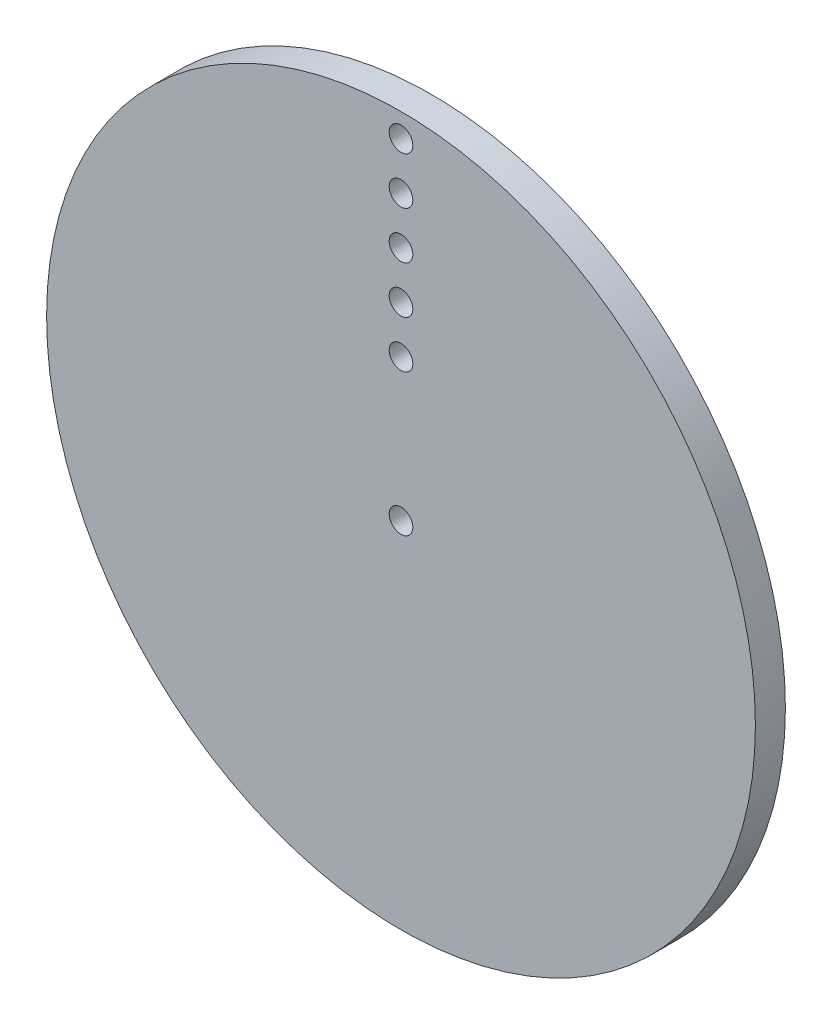
ISO-10303-21;
HEADER;
FILE_DESCRIPTION(('STEP AP214'),'2;1');
FILE_NAME('part.step','',(''),(''),'','','');
FILE_SCHEMA(('AUTOMOTIVE_DESIGN { 1 0 10303 214 1 1 1 1 }'));
ENDSEC;
DATA;
#1=APPLICATION_CONTEXT('core data for automotive mechanical design processes');
#2=APPLICATION_PROTOCOL_DEFINITION('international standard','automotive_design',2000,#1);
#3=PRODUCT_CONTEXT('',#1,'mechanical');
#4=PRODUCT('Part','Part','',(#3));
#5=PRODUCT_RELATED_PRODUCT_CATEGORY('part','',(#4));
#6=PRODUCT_DEFINITION_FORMATION('','',#4);
#7=PRODUCT_DEFINITION_CONTEXT('part definition',#1,'design');
#8=PRODUCT_DEFINITION('design','',#6,#7);
#9=PRODUCT_DEFINITION_SHAPE('','',#8);
#10=(LENGTH_UNIT() NAMED_UNIT(*) SI_UNIT(.MILLI.,.METRE.));
#11=(NAMED_UNIT(*) PLANE_ANGLE_UNIT() SI_UNIT($,.RADIAN.));
#12=(NAMED_UNIT(*) SI_UNIT($,.STERADIAN.) SOLID_ANGLE_UNIT());
#13=UNCERTAINTY_MEASURE_WITH_UNIT(LENGTH_MEASURE(1.E-05),#10,'distance_accuracy_value','');
#14=(GEOMETRIC_REPRESENTATION_CONTEXT(3) GLOBAL_UNCERTAINTY_ASSIGNED_CONTEXT((#13)) GLOBAL_UNIT_ASSIGNED_CONTEXT((#10,
#11,#12)) REPRESENTATION_CONTEXT('',''));
#15=CARTESIAN_POINT('',(0.,0.,0.));
#16=DIRECTION('',(0.,0.,1.));
#17=DIRECTION('',(1.,0.,0.));
#18=AXIS2_PLACEMENT_3D('',#15,#16,#17);
#19=CARTESIAN_POINT('',(0.,0.,6.35));
#20=DIRECTION('',(0.,0.,1.));
#21=DIRECTION('',(1.,0.,0.));
#22=AXIS2_PLACEMENT_3D('',#19,#20,#21);
#23=PLANE('',#22);
#24=CARTESIAN_POINT('',(0.,70.,6.35));
#25=DIRECTION('',(0.,0.,1.));
#26=DIRECTION('',(1.,0.,0.));
#27=AXIS2_PLACEMENT_3D('',#24,#25,#26);
#28=CIRCLE('',#27,2.5);
#29=CARTESIAN_POINT('',(2.5,70.,6.35));
#30=VERTEX_POINT('',#29);
#31=EDGE_CURVE('E68',#30,#30,#28,.T.);
#32=ORIENTED_EDGE('',*,*,#31,.F.);
#33=EDGE_LOOP('',(#32));
#34=FACE_BOUND('',#33,.T.);
#35=CARTESIAN_POINT('',(0.,50.,6.35));
#36=DIRECTION('',(0.,0.,1.));
#37=DIRECTION('',(1.,0.,0.));
#38=AXIS2_PLACEMENT_3D('',#35,#36,#37);
#39=CIRCLE('',#38,2.5);
#40=CARTESIAN_POINT('',(2.5,50.,6.35));
#41=VERTEX_POINT('',#40);
#42=EDGE_CURVE('E56',#41,#41,#39,.T.);
#43=ORIENTED_EDGE('',*,*,#42,.F.);
#44=EDGE_LOOP('',(#43));
#45=FACE_BOUND('',#44,.T.);
#46=CARTESIAN_POINT('',(0.,30.,6.35));
#47=DIRECTION('',(0.,0.,1.));
#48=DIRECTION('',(1.,0.,0.));
#49=AXIS2_PLACEMENT_3D('',#46,#47,#48);
#50=CIRCLE('',#49,2.5);
#51=CARTESIAN_POINT('',(2.5,30.,6.35));
#52=VERTEX_POINT('',#51);
#53=EDGE_CURVE('E45',#52,#52,#50,.T.);
#54=ORIENTED_EDGE('',*,*,#53,.F.);
#55=EDGE_LOOP('',(#54));
#56=FACE_BOUND('',#55,.T.);
#57=CARTESIAN_POINT('',(0.,0.,6.35));
#58=DIRECTION('',(0.,0.,1.));
#59=DIRECTION('',(1.,0.,0.));
#60=AXIS2_PLACEMENT_3D('',#57,#58,#59);
#61=CIRCLE('',#60,75.);
#62=CARTESIAN_POINT('',(75.,0.,6.35));
#63=VERTEX_POINT('',#62);
#64=EDGE_CURVE('E10',#63,#63,#61,.T.);
#65=ORIENTED_EDGE('',*,*,#64,.T.);
#66=EDGE_LOOP('',(#65));
#67=FACE_BOUND('',#66,.T.);
#68=CARTESIAN_POINT('',(0.,40.,6.35));
#69=DIRECTION('',(0.,0.,1.));
#70=DIRECTION('',(1.,0.,0.));
#71=AXIS2_PLACEMENT_3D('',#68,#69,#70);
#72=CIRCLE('',#71,2.5);
#73=CARTESIAN_POINT('',(2.5,40.,6.35));
#74=VERTEX_POINT('',#73);
#75=EDGE_CURVE('E50',#74,#74,#72,.T.);
#76=ORIENTED_EDGE('',*,*,#75,.F.);
#77=EDGE_LOOP('',(#76));
#78=FACE_BOUND('',#77,.T.);
#79=CARTESIAN_POINT('',(0.,60.,6.35));
#80=DIRECTION('',(0.,0.,1.));
#81=DIRECTION('',(1.,0.,0.));
#82=AXIS2_PLACEMENT_3D('',#79,#80,#81);
#83=CIRCLE('',#82,2.5);
#84=CARTESIAN_POINT('',(2.5,60.,6.35));
#85=VERTEX_POINT('',#84);
#86=EDGE_CURVE('E62',#85,#85,#83,.T.);
#87=ORIENTED_EDGE('',*,*,#86,.F.);
#88=EDGE_LOOP('',(#87));
#89=FACE_BOUND('',#88,.T.);
#90=CARTESIAN_POINT('',(0.,0.,6.35));
#91=DIRECTION('',(0.,0.,1.));
#92=DIRECTION('',(1.,0.,0.));
#93=AXIS2_PLACEMENT_3D('',#90,#91,#92);
#94=CIRCLE('',#93,2.5);
#95=CARTESIAN_POINT('',(2.5,0.,6.35));
#96=VERTEX_POINT('',#95);
#97=EDGE_CURVE('E74',#96,#96,#94,.T.);
#98=ORIENTED_EDGE('',*,*,#97,.F.);
#99=EDGE_LOOP('',(#98));
#100=FACE_BOUND('',#99,.T.);
#101=ADVANCED_FACE('F34',(#34,#45,#56,#67,#78,#89,#100),#23,.T.);
#102=CARTESIAN_POINT('',(0.,0.,0.));
#103=DIRECTION('',(0.,0.,1.));
#104=DIRECTION('',(1.,0.,0.));
#105=AXIS2_PLACEMENT_3D('',#102,#103,#104);
#106=PLANE('',#105);
#107=CARTESIAN_POINT('',(0.,0.,0.));
#108=DIRECTION('',(0.,0.,1.));
#109=DIRECTION('',(1.,0.,0.));
#110=AXIS2_PLACEMENT_3D('',#107,#108,#109);
#111=CIRCLE('',#110,75.);
#112=CARTESIAN_POINT('',(75.,0.,0.));
#113=VERTEX_POINT('',#112);
#114=EDGE_CURVE('E38',#113,#113,#111,.T.);
#115=ORIENTED_EDGE('',*,*,#114,.F.);
#116=EDGE_LOOP('',(#115));
#117=FACE_BOUND('',#116,.T.);
#118=CARTESIAN_POINT('',(0.,30.,0.));
#119=DIRECTION('',(0.,0.,1.));
#120=DIRECTION('',(1.,0.,0.));
#121=AXIS2_PLACEMENT_3D('',#118,#119,#120);
#122=CIRCLE('',#121,2.5);
#123=CARTESIAN_POINT('',(2.5,30.,0.));
#124=VERTEX_POINT('',#123);
#125=EDGE_CURVE('E47',#124,#124,#122,.T.);
#126=ORIENTED_EDGE('',*,*,#125,.T.);
#127=EDGE_LOOP('',(#126));
#128=FACE_BOUND('',#127,.T.);
#129=CARTESIAN_POINT('',(0.,40.,0.));
#130=DIRECTION('',(0.,0.,1.));
#131=DIRECTION('',(1.,0.,0.));
#132=AXIS2_PLACEMENT_3D('',#129,#130,#131);
#133=CIRCLE('',#132,2.5);
#134=CARTESIAN_POINT('',(2.5,40.,0.));
#135=VERTEX_POINT('',#134);
#136=EDGE_CURVE('E53',#135,#135,#133,.T.);
#137=ORIENTED_EDGE('',*,*,#136,.T.);
#138=EDGE_LOOP('',(#137));
#139=FACE_BOUND('',#138,.T.);
#140=CARTESIAN_POINT('',(0.,50.,0.));
#141=DIRECTION('',(0.,0.,1.));
#142=DIRECTION('',(1.,0.,0.));
#143=AXIS2_PLACEMENT_3D('',#140,#141,#142);
#144=CIRCLE('',#143,2.5);
#145=CARTESIAN_POINT('',(2.5,50.,0.));
#146=VERTEX_POINT('',#145);
#147=EDGE_CURVE('E59',#146,#146,#144,.T.);
#148=ORIENTED_EDGE('',*,*,#147,.T.);
#149=EDGE_LOOP('',(#148));
#150=FACE_BOUND('',#149,.T.);
#151=CARTESIAN_POINT('',(0.,60.,0.));
#152=DIRECTION('',(0.,0.,1.));
#153=DIRECTION('',(1.,0.,0.));
#154=AXIS2_PLACEMENT_3D('',#151,#152,#153);
#155=CIRCLE('',#154,2.5);
#156=CARTESIAN_POINT('',(2.5,60.,0.));
#157=VERTEX_POINT('',#156);
#158=EDGE_CURVE('E65',#157,#157,#155,.T.);
#159=ORIENTED_EDGE('',*,*,#158,.T.);
#160=EDGE_LOOP('',(#159));
#161=FACE_BOUND('',#160,.T.);
#162=CARTESIAN_POINT('',(0.,70.,0.));
#163=DIRECTION('',(0.,0.,1.));
#164=DIRECTION('',(1.,0.,0.));
#165=AXIS2_PLACEMENT_3D('',#162,#163,#164);
#166=CIRCLE('',#165,2.5);
#167=CARTESIAN_POINT('',(2.5,70.,0.));
#168=VERTEX_POINT('',#167);
#169=EDGE_CURVE('E71',#168,#168,#166,.T.);
#170=ORIENTED_EDGE('',*,*,#169,.T.);
#171=EDGE_LOOP('',(#170));
#172=FACE_BOUND('',#171,.T.);
#173=CARTESIAN_POINT('',(0.,0.,0.));
#174=DIRECTION('',(0.,0.,1.));
#175=DIRECTION('',(1.,0.,0.));
#176=AXIS2_PLACEMENT_3D('',#173,#174,#175);
#177=CIRCLE('',#176,2.5);
#178=CARTESIAN_POINT('',(2.5,0.,0.));
#179=VERTEX_POINT('',#178);
#180=EDGE_CURVE('E77',#179,#179,#177,.T.);
#181=ORIENTED_EDGE('',*,*,#180,.T.);
#182=EDGE_LOOP('',(#181));
#183=FACE_BOUND('',#182,.T.);
#184=ADVANCED_FACE('F87',(#117,#128,#139,#150,#161,#172,#183),#106,.F.);
#185=CARTESIAN_POINT('',(0.,0.,6.35));
#186=DIRECTION('',(0.,0.,-1.));
#187=DIRECTION('',(-1.,0.,0.));
#188=AXIS2_PLACEMENT_3D('',#185,#186,#187);
#189=CYLINDRICAL_SURFACE('',#188,75.);
#190=ORIENTED_EDGE('',*,*,#64,.F.);
#191=EDGE_LOOP('',(#190));
#192=FACE_BOUND('',#191,.T.);
#193=ORIENTED_EDGE('',*,*,#114,.T.);
#194=EDGE_LOOP('',(#193));
#195=FACE_BOUND('',#194,.T.);
#196=ADVANCED_FACE('F36',(#192,#195),#189,.T.);
#197=CARTESIAN_POINT('',(0.,30.,6.35));
#198=DIRECTION('',(0.,0.,-1.));
#199=DIRECTION('',(-1.,0.,0.));
#200=AXIS2_PLACEMENT_3D('',#197,#198,#199);
#201=CYLINDRICAL_SURFACE('',#200,2.5);
#202=ORIENTED_EDGE('',*,*,#53,.T.);
#203=EDGE_LOOP('',(#202));
#204=FACE_BOUND('',#203,.T.);
#205=ORIENTED_EDGE('',*,*,#125,.F.);
#206=EDGE_LOOP('',(#205));
#207=FACE_BOUND('',#206,.T.);
#208=ADVANCED_FACE('F97',(#204,#207),#201,.F.);
#209=CARTESIAN_POINT('',(0.,40.,6.35));
#210=DIRECTION('',(0.,0.,-1.));
#211=DIRECTION('',(-1.,0.,0.));
#212=AXIS2_PLACEMENT_3D('',#209,#210,#211);
#213=CYLINDRICAL_SURFACE('',#212,2.5);
#214=ORIENTED_EDGE('',*,*,#75,.T.);
#215=EDGE_LOOP('',(#214));
#216=FACE_BOUND('',#215,.T.);
#217=ORIENTED_EDGE('',*,*,#136,.F.);
#218=EDGE_LOOP('',(#217));
#219=FACE_BOUND('',#218,.T.);
#220=ADVANCED_FACE('F100',(#216,#219),#213,.F.);
#221=CARTESIAN_POINT('',(0.,50.,6.35));
#222=DIRECTION('',(0.,0.,-1.));
#223=DIRECTION('',(-1.,0.,0.));
#224=AXIS2_PLACEMENT_3D('',#221,#222,#223);
#225=CYLINDRICAL_SURFACE('',#224,2.5);
#226=ORIENTED_EDGE('',*,*,#42,.T.);
#227=EDGE_LOOP('',(#226));
#228=FACE_BOUND('',#227,.T.);
#229=ORIENTED_EDGE('',*,*,#147,.F.);
#230=EDGE_LOOP('',(#229));
#231=FACE_BOUND('',#230,.T.);
#232=ADVANCED_FACE('F104',(#228,#231),#225,.F.);
#233=CARTESIAN_POINT('',(0.,60.,6.35));
#234=DIRECTION('',(0.,0.,-1.));
#235=DIRECTION('',(-1.,0.,0.));
#236=AXIS2_PLACEMENT_3D('',#233,#234,#235);
#237=CYLINDRICAL_SURFACE('',#236,2.5);
#238=ORIENTED_EDGE('',*,*,#86,.T.);
#239=EDGE_LOOP('',(#238));
#240=FACE_BOUND('',#239,.T.);
#241=ORIENTED_EDGE('',*,*,#158,.F.);
#242=EDGE_LOOP('',(#241));
#243=FACE_BOUND('',#242,.T.);
#244=ADVANCED_FACE('F108',(#240,#243),#237,.F.);
#245=CARTESIAN_POINT('',(0.,70.,6.35));
#246=DIRECTION('',(0.,0.,-1.));
#247=DIRECTION('',(-1.,0.,0.));
#248=AXIS2_PLACEMENT_3D('',#245,#246,#247);
#249=CYLINDRICAL_SURFACE('',#248,2.5);
#250=ORIENTED_EDGE('',*,*,#31,.T.);
#251=EDGE_LOOP('',(#250));
#252=FACE_BOUND('',#251,.T.);
#253=ORIENTED_EDGE('',*,*,#169,.F.);
#254=EDGE_LOOP('',(#253));
#255=FACE_BOUND('',#254,.T.);
#256=ADVANCED_FACE('F112',(#252,#255),#249,.F.);
#257=CARTESIAN_POINT('',(0.,0.,6.35));
#258=DIRECTION('',(0.,0.,-1.));
#259=DIRECTION('',(-1.,0.,0.));
#260=AXIS2_PLACEMENT_3D('',#257,#258,#259);
#261=CYLINDRICAL_SURFACE('',#260,2.5);
#262=ORIENTED_EDGE('',*,*,#97,.T.);
#263=EDGE_LOOP('',(#262));
#264=FACE_BOUND('',#263,.T.);
#265=ORIENTED_EDGE('',*,*,#180,.F.);
#266=EDGE_LOOP('',(#265));
#267=FACE_BOUND('',#266,.T.);
#268=ADVANCED_FACE('F83',(#264,#267),#261,.F.);
#269=CLOSED_SHELL('',(#101,#184,#196,#208,#220,#232,#244,#256,#268));
#270=MANIFOLD_SOLID_BREP('B2',#269);
#271=ADVANCED_BREP_SHAPE_REPRESENTATION('',(#18,#270),#14);
#272=SHAPE_DEFINITION_REPRESENTATION(#9,#271);
ENDSEC;
END-ISO-10303-21;
